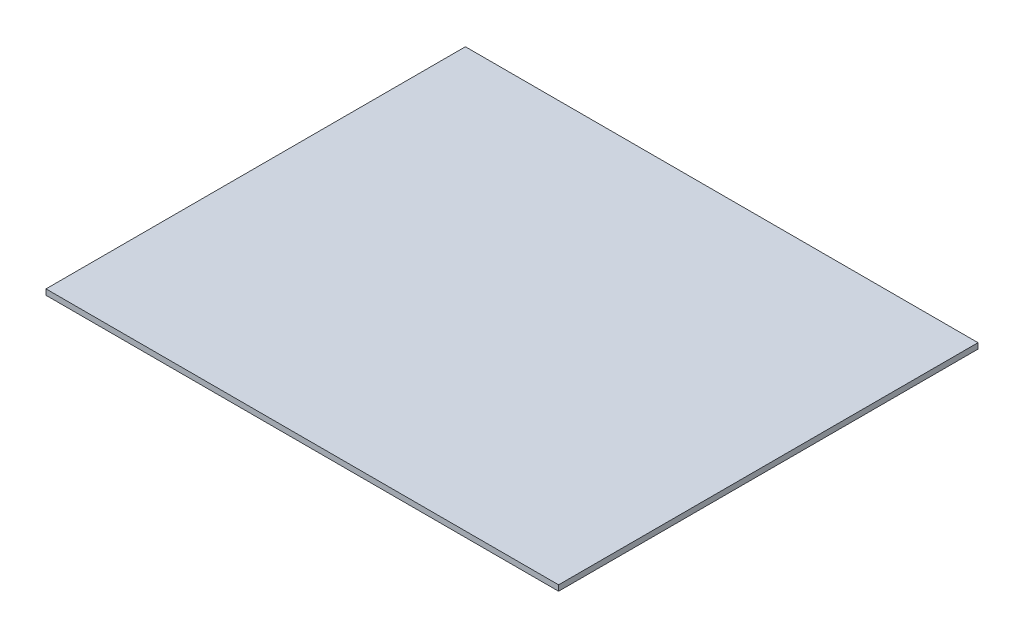
ISO-10303-21;
HEADER;
FILE_DESCRIPTION(('STEP AP214'),'2;1');
FILE_NAME('part.step','',(''),(''),'','','');
FILE_SCHEMA(('AUTOMOTIVE_DESIGN { 1 0 10303 214 1 1 1 1 }'));
ENDSEC;
DATA;
#1=APPLICATION_CONTEXT('core data for automotive mechanical design processes');
#2=APPLICATION_PROTOCOL_DEFINITION('international standard','automotive_design',2000,#1);
#3=PRODUCT_CONTEXT('',#1,'mechanical');
#4=PRODUCT('Part','Part','',(#3));
#5=PRODUCT_RELATED_PRODUCT_CATEGORY('part','',(#4));
#6=PRODUCT_DEFINITION_FORMATION('','',#4);
#7=PRODUCT_DEFINITION_CONTEXT('part definition',#1,'design');
#8=PRODUCT_DEFINITION('design','',#6,#7);
#9=PRODUCT_DEFINITION_SHAPE('','',#8);
#10=(LENGTH_UNIT() NAMED_UNIT(*) SI_UNIT(.MILLI.,.METRE.));
#11=(NAMED_UNIT(*) PLANE_ANGLE_UNIT() SI_UNIT($,.RADIAN.));
#12=(NAMED_UNIT(*) SI_UNIT($,.STERADIAN.) SOLID_ANGLE_UNIT());
#13=UNCERTAINTY_MEASURE_WITH_UNIT(LENGTH_MEASURE(1.E-05),#10,'distance_accuracy_value','');
#14=(GEOMETRIC_REPRESENTATION_CONTEXT(3) GLOBAL_UNCERTAINTY_ASSIGNED_CONTEXT((#13)) GLOBAL_UNIT_ASSIGNED_CONTEXT((#10,
#11,#12)) REPRESENTATION_CONTEXT('',''));
#15=CARTESIAN_POINT('',(0.,0.,0.));
#16=DIRECTION('',(0.,0.,1.));
#17=DIRECTION('',(1.,0.,0.));
#18=AXIS2_PLACEMENT_3D('',#15,#16,#17);
#19=CARTESIAN_POINT('',(-550.,6.,450.));
#20=DIRECTION('',(1.,0.,0.));
#21=DIRECTION('',(0.,0.,-1.));
#22=AXIS2_PLACEMENT_3D('',#19,#20,#21);
#23=PLANE('',#22);
#24=DIRECTION('',(0.,0.,1.));
#25=VECTOR('',#24,1.);
#26=CARTESIAN_POINT('',(-550.,-6.,450.));
#27=LINE('',#26,#25);
#28=CARTESIAN_POINT('',(-550.,-6.,-450.));
#29=VERTEX_POINT('',#28);
#30=CARTESIAN_POINT('',(-550.,-6.,450.));
#31=VERTEX_POINT('',#30);
#32=EDGE_CURVE('E98',#29,#31,#27,.T.);
#33=ORIENTED_EDGE('',*,*,#32,.T.);
#34=DIRECTION('',(0.,-1.,0.));
#35=VECTOR('',#34,1.);
#36=CARTESIAN_POINT('',(-550.,6.,450.));
#37=LINE('',#36,#35);
#38=CARTESIAN_POINT('',(-550.,6.,450.));
#39=VERTEX_POINT('',#38);
#40=EDGE_CURVE('E11',#39,#31,#37,.T.);
#41=ORIENTED_EDGE('',*,*,#40,.F.);
#42=DIRECTION('',(0.,0.,1.));
#43=VECTOR('',#42,1.);
#44=CARTESIAN_POINT('',(-550.,6.,450.));
#45=LINE('',#44,#43);
#46=CARTESIAN_POINT('',(-550.,6.,-450.));
#47=VERTEX_POINT('',#46);
#48=EDGE_CURVE('E86',#47,#39,#45,.T.);
#49=ORIENTED_EDGE('',*,*,#48,.F.);
#50=DIRECTION('',(0.,-1.,0.));
#51=VECTOR('',#50,1.);
#52=CARTESIAN_POINT('',(-550.,6.,-450.));
#53=LINE('',#52,#51);
#54=EDGE_CURVE('E94',#47,#29,#53,.T.);
#55=ORIENTED_EDGE('',*,*,#54,.T.);
#56=EDGE_LOOP('',(#33,#41,#49,#55));
#57=FACE_BOUND('',#56,.T.);
#58=ADVANCED_FACE('F35',(#57),#23,.F.);
#59=CARTESIAN_POINT('',(550.,6.,450.));
#60=DIRECTION('',(0.,0.,-1.));
#61=DIRECTION('',(-1.,0.,0.));
#62=AXIS2_PLACEMENT_3D('',#59,#60,#61);
#63=PLANE('',#62);
#64=DIRECTION('',(1.,0.,0.));
#65=VECTOR('',#64,1.);
#66=CARTESIAN_POINT('',(550.,-6.,450.));
#67=LINE('',#66,#65);
#68=CARTESIAN_POINT('',(550.,-6.,450.));
#69=VERTEX_POINT('',#68);
#70=EDGE_CURVE('E90',#31,#69,#67,.T.);
#71=ORIENTED_EDGE('',*,*,#70,.T.);
#72=DIRECTION('',(0.,-1.,0.));
#73=VECTOR('',#72,1.);
#74=CARTESIAN_POINT('',(550.,6.,450.));
#75=LINE('',#74,#73);
#76=CARTESIAN_POINT('',(550.,6.,450.));
#77=VERTEX_POINT('',#76);
#78=EDGE_CURVE('E43',#77,#69,#75,.T.);
#79=ORIENTED_EDGE('',*,*,#78,.F.);
#80=DIRECTION('',(1.,0.,0.));
#81=VECTOR('',#80,1.);
#82=CARTESIAN_POINT('',(550.,6.,450.));
#83=LINE('',#82,#81);
#84=EDGE_CURVE('E81',#39,#77,#83,.T.);
#85=ORIENTED_EDGE('',*,*,#84,.F.);
#86=ORIENTED_EDGE('',*,*,#40,.T.);
#87=EDGE_LOOP('',(#71,#79,#85,#86));
#88=FACE_BOUND('',#87,.T.);
#89=ADVANCED_FACE('F89',(#88),#63,.F.);
#90=CARTESIAN_POINT('',(550.,6.,450.));
#91=DIRECTION('',(-1.,0.,0.));
#92=DIRECTION('',(0.,0.,1.));
#93=AXIS2_PLACEMENT_3D('',#90,#91,#92);
#94=PLANE('',#93);
#95=DIRECTION('',(0.,0.,-1.));
#96=VECTOR('',#95,1.);
#97=CARTESIAN_POINT('',(550.,-6.,450.));
#98=LINE('',#97,#96);
#99=CARTESIAN_POINT('',(550.,-6.,-450.));
#100=VERTEX_POINT('',#99);
#101=EDGE_CURVE('E68',#69,#100,#98,.T.);
#102=ORIENTED_EDGE('',*,*,#101,.T.);
#103=DIRECTION('',(0.,-1.,0.));
#104=VECTOR('',#103,1.);
#105=CARTESIAN_POINT('',(550.,6.,-450.));
#106=LINE('',#105,#104);
#107=CARTESIAN_POINT('',(550.,6.,-450.));
#108=VERTEX_POINT('',#107);
#109=EDGE_CURVE('E91',#108,#100,#106,.T.);
#110=ORIENTED_EDGE('',*,*,#109,.F.);
#111=DIRECTION('',(0.,0.,-1.));
#112=VECTOR('',#111,1.);
#113=CARTESIAN_POINT('',(550.,6.,450.));
#114=LINE('',#113,#112);
#115=EDGE_CURVE('E84',#77,#108,#114,.T.);
#116=ORIENTED_EDGE('',*,*,#115,.F.);
#117=ORIENTED_EDGE('',*,*,#78,.T.);
#118=EDGE_LOOP('',(#102,#110,#116,#117));
#119=FACE_BOUND('',#118,.T.);
#120=ADVANCED_FACE('F92',(#119),#94,.F.);
#121=CARTESIAN_POINT('',(550.,6.,-450.));
#122=DIRECTION('',(0.,0.,1.));
#123=DIRECTION('',(1.,0.,0.));
#124=AXIS2_PLACEMENT_3D('',#121,#122,#123);
#125=PLANE('',#124);
#126=DIRECTION('',(-1.,0.,0.));
#127=VECTOR('',#126,1.);
#128=CARTESIAN_POINT('',(550.,-6.,-450.));
#129=LINE('',#128,#127);
#130=EDGE_CURVE('E74',#100,#29,#129,.T.);
#131=ORIENTED_EDGE('',*,*,#130,.T.);
#132=ORIENTED_EDGE('',*,*,#54,.F.);
#133=DIRECTION('',(-1.,0.,0.));
#134=VECTOR('',#133,1.);
#135=CARTESIAN_POINT('',(550.,6.,-450.));
#136=LINE('',#135,#134);
#137=EDGE_CURVE('E51',#108,#47,#136,.T.);
#138=ORIENTED_EDGE('',*,*,#137,.F.);
#139=ORIENTED_EDGE('',*,*,#109,.T.);
#140=EDGE_LOOP('',(#131,#132,#138,#139));
#141=FACE_BOUND('',#140,.T.);
#142=ADVANCED_FACE('F105',(#141),#125,.F.);
#143=CARTESIAN_POINT('',(0.,6.,0.));
#144=DIRECTION('',(0.,1.,0.));
#145=DIRECTION('',(0.,0.,1.));
#146=AXIS2_PLACEMENT_3D('',#143,#144,#145);
#147=PLANE('',#146);
#148=ORIENTED_EDGE('',*,*,#48,.T.);
#149=ORIENTED_EDGE('',*,*,#84,.T.);
#150=ORIENTED_EDGE('',*,*,#115,.T.);
#151=ORIENTED_EDGE('',*,*,#137,.T.);
#152=EDGE_LOOP('',(#148,#149,#150,#151));
#153=FACE_BOUND('',#152,.T.);
#154=ADVANCED_FACE('F82',(#153),#147,.T.);
#155=CARTESIAN_POINT('',(0.,-6.,0.));
#156=DIRECTION('',(0.,1.,0.));
#157=DIRECTION('',(0.,0.,1.));
#158=AXIS2_PLACEMENT_3D('',#155,#156,#157);
#159=PLANE('',#158);
#160=ORIENTED_EDGE('',*,*,#32,.F.);
#161=ORIENTED_EDGE('',*,*,#130,.F.);
#162=ORIENTED_EDGE('',*,*,#101,.F.);
#163=ORIENTED_EDGE('',*,*,#70,.F.);
#164=EDGE_LOOP('',(#160,#161,#162,#163));
#165=FACE_BOUND('',#164,.T.);
#166=ADVANCED_FACE('F108',(#165),#159,.F.);
#167=CLOSED_SHELL('',(#58,#89,#120,#142,#154,#166));
#168=MANIFOLD_SOLID_BREP('B2',#167);
#169=ADVANCED_BREP_SHAPE_REPRESENTATION('',(#18,#168),#14);
#170=SHAPE_DEFINITION_REPRESENTATION(#9,#169);
ENDSEC;
END-ISO-10303-21;
